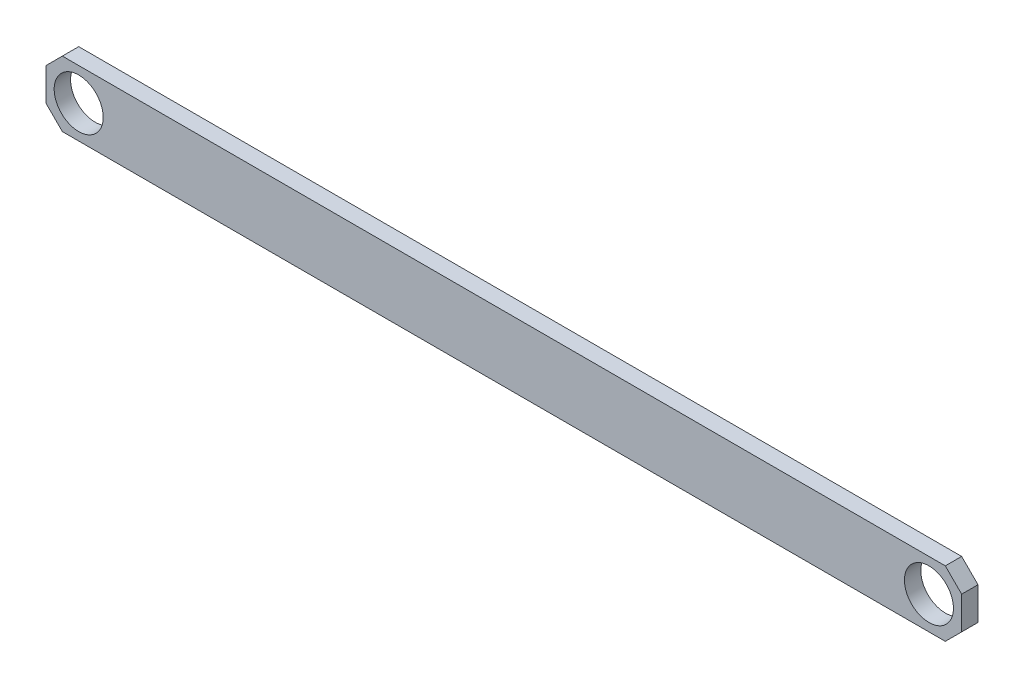
ISO-10303-21;
HEADER;
FILE_DESCRIPTION(('STEP AP214'),'2;1');
FILE_NAME('part.step','',(''),(''),'','','');
FILE_SCHEMA(('AUTOMOTIVE_DESIGN { 1 0 10303 214 1 1 1 1 }'));
ENDSEC;
DATA;
#1=APPLICATION_CONTEXT('core data for automotive mechanical design processes');
#2=APPLICATION_PROTOCOL_DEFINITION('international standard','automotive_design',2000,#1);
#3=PRODUCT_CONTEXT('',#1,'mechanical');
#4=PRODUCT('Part','Part','',(#3));
#5=PRODUCT_RELATED_PRODUCT_CATEGORY('part','',(#4));
#6=PRODUCT_DEFINITION_FORMATION('','',#4);
#7=PRODUCT_DEFINITION_CONTEXT('part definition',#1,'design');
#8=PRODUCT_DEFINITION('design','',#6,#7);
#9=PRODUCT_DEFINITION_SHAPE('','',#8);
#10=(LENGTH_UNIT() NAMED_UNIT(*) SI_UNIT(.MILLI.,.METRE.));
#11=(NAMED_UNIT(*) PLANE_ANGLE_UNIT() SI_UNIT($,.RADIAN.));
#12=(NAMED_UNIT(*) SI_UNIT($,.STERADIAN.) SOLID_ANGLE_UNIT());
#13=UNCERTAINTY_MEASURE_WITH_UNIT(LENGTH_MEASURE(1.E-05),#10,'distance_accuracy_value','');
#14=(GEOMETRIC_REPRESENTATION_CONTEXT(3) GLOBAL_UNCERTAINTY_ASSIGNED_CONTEXT((#13)) GLOBAL_UNIT_ASSIGNED_CONTEXT((#10,
#11,#12)) REPRESENTATION_CONTEXT('',''));
#15=CARTESIAN_POINT('',(0.,0.,0.));
#16=DIRECTION('',(0.,0.,1.));
#17=DIRECTION('',(1.,0.,0.));
#18=AXIS2_PLACEMENT_3D('',#15,#16,#17);
#19=CARTESIAN_POINT('',(0.,12.7,3.175));
#20=DIRECTION('',(0.,0.,-1.));
#21=DIRECTION('',(-1.,0.,0.));
#22=AXIS2_PLACEMENT_3D('',#19,#20,#21);
#23=PLANE('',#22);
#24=DIRECTION('',(-1.,0.,0.));
#25=VECTOR('',#24,1.);
#26=CARTESIAN_POINT('',(0.,12.7,3.175));
#27=LINE('',#26,#25);
#28=CARTESIAN_POINT('',(174.625,12.7,3.175));
#29=VERTEX_POINT('',#28);
#30=CARTESIAN_POINT('',(3.17500000000001,12.7,3.175));
#31=VERTEX_POINT('',#30);
#32=EDGE_CURVE('E140',#29,#31,#27,.T.);
#33=ORIENTED_EDGE('',*,*,#32,.T.);
#34=DIRECTION('',(0.707106781186549,0.707106781186546,0.));
#35=VECTOR('',#34,1.);
#36=CARTESIAN_POINT('',(0.,9.525,3.175));
#37=LINE('',#36,#35);
#38=CARTESIAN_POINT('',(0.,9.525,3.175));
#39=VERTEX_POINT('',#38);
#40=EDGE_CURVE('E159',#31,#39,#37,.F.);
#41=ORIENTED_EDGE('',*,*,#40,.T.);
#42=DIRECTION('',(0.,-1.,0.));
#43=VECTOR('',#42,1.);
#44=CARTESIAN_POINT('',(0.,0.,3.175));
#45=LINE('',#44,#43);
#46=CARTESIAN_POINT('',(0.,3.17500000000001,3.175));
#47=VERTEX_POINT('',#46);
#48=EDGE_CURVE('E123',#39,#47,#45,.T.);
#49=ORIENTED_EDGE('',*,*,#48,.T.);
#50=DIRECTION('',(-0.707106781186546,0.707106781186549,0.));
#51=VECTOR('',#50,1.);
#52=CARTESIAN_POINT('',(3.175,0.,3.175));
#53=LINE('',#52,#51);
#54=CARTESIAN_POINT('',(3.175,0.,3.175));
#55=VERTEX_POINT('',#54);
#56=EDGE_CURVE('E157',#47,#55,#53,.F.);
#57=ORIENTED_EDGE('',*,*,#56,.T.);
#58=DIRECTION('',(1.,0.,0.));
#59=VECTOR('',#58,1.);
#60=CARTESIAN_POINT('',(0.,0.,3.175));
#61=LINE('',#60,#59);
#62=CARTESIAN_POINT('',(174.625,0.,3.175));
#63=VERTEX_POINT('',#62);
#64=EDGE_CURVE('E170',#55,#63,#61,.T.);
#65=ORIENTED_EDGE('',*,*,#64,.T.);
#66=DIRECTION('',(-0.707106781186547,-0.707106781186548,0.));
#67=VECTOR('',#66,1.);
#68=CARTESIAN_POINT('',(177.8,3.17500000000001,3.175));
#69=LINE('',#68,#67);
#70=CARTESIAN_POINT('',(177.8,3.17500000000001,3.175));
#71=VERTEX_POINT('',#70);
#72=EDGE_CURVE('E58',#63,#71,#69,.F.);
#73=ORIENTED_EDGE('',*,*,#72,.T.);
#74=DIRECTION('',(0.,1.,0.));
#75=VECTOR('',#74,1.);
#76=CARTESIAN_POINT('',(177.8,0.,3.175));
#77=LINE('',#76,#75);
#78=CARTESIAN_POINT('',(177.8,9.525,3.175));
#79=VERTEX_POINT('',#78);
#80=EDGE_CURVE('E178',#71,#79,#77,.T.);
#81=ORIENTED_EDGE('',*,*,#80,.T.);
#82=DIRECTION('',(0.707106781186549,-0.707106781186546,0.));
#83=VECTOR('',#82,1.);
#84=CARTESIAN_POINT('',(174.625,12.7,3.175));
#85=LINE('',#84,#83);
#86=EDGE_CURVE('E154',#79,#29,#85,.F.);
#87=ORIENTED_EDGE('',*,*,#86,.T.);
#88=EDGE_LOOP('',(#33,#41,#49,#57,#65,#73,#81,#87));
#89=FACE_BOUND('',#88,.T.);
#90=CARTESIAN_POINT('',(6.35,6.35,3.175));
#91=DIRECTION('',(0.,0.,1.));
#92=DIRECTION('',(1.,0.,0.));
#93=AXIS2_PLACEMENT_3D('',#90,#91,#92);
#94=CIRCLE('',#93,4.7625);
#95=CARTESIAN_POINT('',(11.1125,6.35,3.175));
#96=VERTEX_POINT('',#95);
#97=EDGE_CURVE('E131',#96,#96,#94,.T.);
#98=ORIENTED_EDGE('',*,*,#97,.F.);
#99=EDGE_LOOP('',(#98));
#100=FACE_BOUND('',#99,.T.);
#101=CARTESIAN_POINT('',(171.45,6.35,3.175));
#102=DIRECTION('',(0.,0.,1.));
#103=DIRECTION('',(-1.,0.,0.));
#104=AXIS2_PLACEMENT_3D('',#101,#102,#103);
#105=CIRCLE('',#104,4.76249999999998);
#106=CARTESIAN_POINT('',(166.6875,6.35,3.175));
#107=VERTEX_POINT('',#106);
#108=EDGE_CURVE('E185',#107,#107,#105,.T.);
#109=ORIENTED_EDGE('',*,*,#108,.F.);
#110=EDGE_LOOP('',(#109));
#111=FACE_BOUND('',#110,.T.);
#112=ADVANCED_FACE('F37',(#89,#100,#111),#23,.F.);
#113=CARTESIAN_POINT('',(0.,12.7,0.));
#114=DIRECTION('',(0.,0.,-1.));
#115=DIRECTION('',(-1.,0.,0.));
#116=AXIS2_PLACEMENT_3D('',#113,#114,#115);
#117=PLANE('',#116);
#118=CARTESIAN_POINT('',(6.35,6.35,0.));
#119=DIRECTION('',(0.,0.,1.));
#120=DIRECTION('',(1.,0.,0.));
#121=AXIS2_PLACEMENT_3D('',#118,#119,#120);
#122=CIRCLE('',#121,4.7625);
#123=CARTESIAN_POINT('',(11.1125,6.35,0.));
#124=VERTEX_POINT('',#123);
#125=EDGE_CURVE('E137',#124,#124,#122,.T.);
#126=ORIENTED_EDGE('',*,*,#125,.T.);
#127=EDGE_LOOP('',(#126));
#128=FACE_BOUND('',#127,.T.);
#129=DIRECTION('',(0.,-1.,0.));
#130=VECTOR('',#129,1.);
#131=CARTESIAN_POINT('',(0.,0.,0.));
#132=LINE('',#131,#130);
#133=CARTESIAN_POINT('',(0.,9.525,0.));
#134=VERTEX_POINT('',#133);
#135=CARTESIAN_POINT('',(0.,3.17500000000001,0.));
#136=VERTEX_POINT('',#135);
#137=EDGE_CURVE('E120',#134,#136,#132,.T.);
#138=ORIENTED_EDGE('',*,*,#137,.F.);
#139=DIRECTION('',(-0.707106781186549,-0.707106781186546,0.));
#140=VECTOR('',#139,1.);
#141=CARTESIAN_POINT('',(1.5875,11.1125,0.));
#142=LINE('',#141,#140);
#143=CARTESIAN_POINT('',(3.17500000000001,12.7,0.));
#144=VERTEX_POINT('',#143);
#145=EDGE_CURVE('E103',#134,#144,#142,.F.);
#146=ORIENTED_EDGE('',*,*,#145,.T.);
#147=DIRECTION('',(-1.,0.,0.));
#148=VECTOR('',#147,1.);
#149=CARTESIAN_POINT('',(0.,12.7,0.));
#150=LINE('',#149,#148);
#151=CARTESIAN_POINT('',(174.625,12.7,0.));
#152=VERTEX_POINT('',#151);
#153=EDGE_CURVE('E144',#152,#144,#150,.T.);
#154=ORIENTED_EDGE('',*,*,#153,.F.);
#155=DIRECTION('',(-0.707106781186549,0.707106781186546,0.));
#156=VECTOR('',#155,1.);
#157=CARTESIAN_POINT('',(87.3124999999997,100.0125,0.));
#158=LINE('',#157,#156);
#159=CARTESIAN_POINT('',(177.8,9.525,0.));
#160=VERTEX_POINT('',#159);
#161=EDGE_CURVE('E124',#152,#160,#158,.F.);
#162=ORIENTED_EDGE('',*,*,#161,.T.);
#163=DIRECTION('',(0.,1.,0.));
#164=VECTOR('',#163,1.);
#165=CARTESIAN_POINT('',(177.8,0.,0.));
#166=LINE('',#165,#164);
#167=CARTESIAN_POINT('',(177.8,3.17500000000001,0.));
#168=VERTEX_POINT('',#167);
#169=EDGE_CURVE('E134',#168,#160,#166,.T.);
#170=ORIENTED_EDGE('',*,*,#169,.F.);
#171=DIRECTION('',(0.707106781186547,0.707106781186548,0.));
#172=VECTOR('',#171,1.);
#173=CARTESIAN_POINT('',(93.6625,-80.9625,0.));
#174=LINE('',#173,#172);
#175=CARTESIAN_POINT('',(174.625,0.,0.));
#176=VERTEX_POINT('',#175);
#177=EDGE_CURVE('E148',#168,#176,#174,.F.);
#178=ORIENTED_EDGE('',*,*,#177,.T.);
#179=DIRECTION('',(1.,0.,0.));
#180=VECTOR('',#179,1.);
#181=CARTESIAN_POINT('',(0.,0.,0.));
#182=LINE('',#181,#180);
#183=CARTESIAN_POINT('',(3.175,0.,0.));
#184=VERTEX_POINT('',#183);
#185=EDGE_CURVE('E130',#184,#176,#182,.T.);
#186=ORIENTED_EDGE('',*,*,#185,.F.);
#187=DIRECTION('',(0.707106781186546,-0.707106781186549,0.));
#188=VECTOR('',#187,1.);
#189=CARTESIAN_POINT('',(-4.76249999999999,7.93750000000002,0.));
#190=LINE('',#189,#188);
#191=EDGE_CURVE('E114',#184,#136,#190,.F.);
#192=ORIENTED_EDGE('',*,*,#191,.T.);
#193=EDGE_LOOP('',(#138,#146,#154,#162,#170,#178,#186,#192));
#194=FACE_BOUND('',#193,.T.);
#195=CARTESIAN_POINT('',(171.45,6.35,0.));
#196=DIRECTION('',(0.,0.,1.));
#197=DIRECTION('',(-1.,0.,0.));
#198=AXIS2_PLACEMENT_3D('',#195,#196,#197);
#199=CIRCLE('',#198,4.76249999999998);
#200=CARTESIAN_POINT('',(166.6875,6.35,0.));
#201=VERTEX_POINT('',#200);
#202=EDGE_CURVE('E187',#201,#201,#199,.T.);
#203=ORIENTED_EDGE('',*,*,#202,.T.);
#204=EDGE_LOOP('',(#203));
#205=FACE_BOUND('',#204,.T.);
#206=ADVANCED_FACE('F127',(#128,#194,#205),#117,.T.);
#207=CARTESIAN_POINT('',(0.,0.,3.175));
#208=DIRECTION('',(1.,0.,0.));
#209=DIRECTION('',(0.,0.,-1.));
#210=AXIS2_PLACEMENT_3D('',#207,#208,#209);
#211=PLANE('',#210);
#212=ORIENTED_EDGE('',*,*,#48,.F.);
#213=DIRECTION('',(0.,0.,-1.));
#214=VECTOR('',#213,1.);
#215=CARTESIAN_POINT('',(0.,9.525,3.175));
#216=LINE('',#215,#214);
#217=EDGE_CURVE('E107',#39,#134,#216,.T.);
#218=ORIENTED_EDGE('',*,*,#217,.T.);
#219=ORIENTED_EDGE('',*,*,#137,.T.);
#220=DIRECTION('',(0.,0.,1.));
#221=VECTOR('',#220,1.);
#222=CARTESIAN_POINT('',(0.,3.17500000000001,3.175));
#223=LINE('',#222,#221);
#224=EDGE_CURVE('E125',#136,#47,#223,.T.);
#225=ORIENTED_EDGE('',*,*,#224,.T.);
#226=EDGE_LOOP('',(#212,#218,#219,#225));
#227=FACE_BOUND('',#226,.T.);
#228=ADVANCED_FACE('F119',(#227),#211,.F.);
#229=CARTESIAN_POINT('',(0.,0.,3.175));
#230=DIRECTION('',(0.,1.,0.));
#231=DIRECTION('',(0.,0.,1.));
#232=AXIS2_PLACEMENT_3D('',#229,#230,#231);
#233=PLANE('',#232);
#234=ORIENTED_EDGE('',*,*,#64,.F.);
#235=DIRECTION('',(0.,0.,-1.));
#236=VECTOR('',#235,1.);
#237=CARTESIAN_POINT('',(3.175,0.,3.175));
#238=LINE('',#237,#236);
#239=EDGE_CURVE('E163',#55,#184,#238,.T.);
#240=ORIENTED_EDGE('',*,*,#239,.T.);
#241=ORIENTED_EDGE('',*,*,#185,.T.);
#242=DIRECTION('',(0.,0.,1.));
#243=VECTOR('',#242,1.);
#244=CARTESIAN_POINT('',(174.625,0.,3.175));
#245=LINE('',#244,#243);
#246=EDGE_CURVE('E161',#176,#63,#245,.T.);
#247=ORIENTED_EDGE('',*,*,#246,.T.);
#248=EDGE_LOOP('',(#234,#240,#241,#247));
#249=FACE_BOUND('',#248,.T.);
#250=ADVANCED_FACE('F168',(#249),#233,.F.);
#251=CARTESIAN_POINT('',(177.8,0.,3.175));
#252=DIRECTION('',(-1.,0.,0.));
#253=DIRECTION('',(0.,0.,1.));
#254=AXIS2_PLACEMENT_3D('',#251,#252,#253);
#255=PLANE('',#254);
#256=ORIENTED_EDGE('',*,*,#80,.F.);
#257=DIRECTION('',(0.,0.,-1.));
#258=VECTOR('',#257,1.);
#259=CARTESIAN_POINT('',(177.8,3.17500000000001,3.175));
#260=LINE('',#259,#258);
#261=EDGE_CURVE('E11',#71,#168,#260,.T.);
#262=ORIENTED_EDGE('',*,*,#261,.T.);
#263=ORIENTED_EDGE('',*,*,#169,.T.);
#264=DIRECTION('',(0.,0.,1.));
#265=VECTOR('',#264,1.);
#266=CARTESIAN_POINT('',(177.8,9.525,3.175));
#267=LINE('',#266,#265);
#268=EDGE_CURVE('E45',#160,#79,#267,.T.);
#269=ORIENTED_EDGE('',*,*,#268,.T.);
#270=EDGE_LOOP('',(#256,#262,#263,#269));
#271=FACE_BOUND('',#270,.T.);
#272=ADVANCED_FACE('F177',(#271),#255,.F.);
#273=CARTESIAN_POINT('',(0.,12.7,3.175));
#274=DIRECTION('',(0.,-1.,0.));
#275=DIRECTION('',(0.,0.,-1.));
#276=AXIS2_PLACEMENT_3D('',#273,#274,#275);
#277=PLANE('',#276);
#278=ORIENTED_EDGE('',*,*,#153,.T.);
#279=DIRECTION('',(0.,0.,1.));
#280=VECTOR('',#279,1.);
#281=CARTESIAN_POINT('',(3.17500000000001,12.7,3.175));
#282=LINE('',#281,#280);
#283=EDGE_CURVE('E108',#144,#31,#282,.T.);
#284=ORIENTED_EDGE('',*,*,#283,.T.);
#285=ORIENTED_EDGE('',*,*,#32,.F.);
#286=DIRECTION('',(0.,0.,-1.));
#287=VECTOR('',#286,1.);
#288=CARTESIAN_POINT('',(174.625,12.7,3.175));
#289=LINE('',#288,#287);
#290=EDGE_CURVE('E113',#29,#152,#289,.T.);
#291=ORIENTED_EDGE('',*,*,#290,.T.);
#292=EDGE_LOOP('',(#278,#284,#285,#291));
#293=FACE_BOUND('',#292,.T.);
#294=ADVANCED_FACE('F208',(#293),#277,.F.);
#295=CARTESIAN_POINT('',(6.35,6.35,3.175));
#296=DIRECTION('',(0.,0.,-1.));
#297=DIRECTION('',(-1.,0.,0.));
#298=AXIS2_PLACEMENT_3D('',#295,#296,#297);
#299=CYLINDRICAL_SURFACE('',#298,4.7625);
#300=ORIENTED_EDGE('',*,*,#97,.T.);
#301=EDGE_LOOP('',(#300));
#302=FACE_BOUND('',#301,.T.);
#303=ORIENTED_EDGE('',*,*,#125,.F.);
#304=EDGE_LOOP('',(#303));
#305=FACE_BOUND('',#304,.T.);
#306=ADVANCED_FACE('F205',(#302,#305),#299,.F.);
#307=CARTESIAN_POINT('',(171.45,6.35,3.175));
#308=DIRECTION('',(0.,0.,-1.));
#309=DIRECTION('',(-1.,0.,0.));
#310=AXIS2_PLACEMENT_3D('',#307,#308,#309);
#311=CYLINDRICAL_SURFACE('',#310,4.76249999999998);
#312=ORIENTED_EDGE('',*,*,#108,.T.);
#313=EDGE_LOOP('',(#312));
#314=FACE_BOUND('',#313,.T.);
#315=ORIENTED_EDGE('',*,*,#202,.F.);
#316=EDGE_LOOP('',(#315));
#317=FACE_BOUND('',#316,.T.);
#318=ADVANCED_FACE('F193',(#314,#317),#311,.F.);
#319=CARTESIAN_POINT('',(0.,9.525,3.175));
#320=DIRECTION('',(0.707106781186546,-0.707106781186549,0.));
#321=DIRECTION('',(0.707106781186549,0.707106781186546,0.));
#322=AXIS2_PLACEMENT_3D('',#319,#320,#321);
#323=PLANE('',#322);
#324=ORIENTED_EDGE('',*,*,#40,.F.);
#325=ORIENTED_EDGE('',*,*,#283,.F.);
#326=ORIENTED_EDGE('',*,*,#145,.F.);
#327=ORIENTED_EDGE('',*,*,#217,.F.);
#328=EDGE_LOOP('',(#324,#325,#326,#327));
#329=FACE_BOUND('',#328,.T.);
#330=ADVANCED_FACE('F106',(#329),#323,.F.);
#331=CARTESIAN_POINT('',(3.175,0.,3.175));
#332=DIRECTION('',(0.707106781186549,0.707106781186546,0.));
#333=DIRECTION('',(-0.707106781186546,0.707106781186549,0.));
#334=AXIS2_PLACEMENT_3D('',#331,#332,#333);
#335=PLANE('',#334);
#336=ORIENTED_EDGE('',*,*,#56,.F.);
#337=ORIENTED_EDGE('',*,*,#224,.F.);
#338=ORIENTED_EDGE('',*,*,#191,.F.);
#339=ORIENTED_EDGE('',*,*,#239,.F.);
#340=EDGE_LOOP('',(#336,#337,#338,#339));
#341=FACE_BOUND('',#340,.T.);
#342=ADVANCED_FACE('F220',(#341),#335,.F.);
#343=CARTESIAN_POINT('',(177.8,3.17500000000001,3.175));
#344=DIRECTION('',(-0.707106781186547,0.707106781186547,0.));
#345=DIRECTION('',(-0.707106781186547,-0.707106781186548,0.));
#346=AXIS2_PLACEMENT_3D('',#343,#344,#345);
#347=PLANE('',#346);
#348=ORIENTED_EDGE('',*,*,#72,.F.);
#349=ORIENTED_EDGE('',*,*,#246,.F.);
#350=ORIENTED_EDGE('',*,*,#177,.F.);
#351=ORIENTED_EDGE('',*,*,#261,.F.);
#352=EDGE_LOOP('',(#348,#349,#350,#351));
#353=FACE_BOUND('',#352,.T.);
#354=ADVANCED_FACE('F176',(#353),#347,.F.);
#355=CARTESIAN_POINT('',(174.625,12.7,3.175));
#356=DIRECTION('',(-0.707106781186546,-0.707106781186549,0.));
#357=DIRECTION('',(0.707106781186549,-0.707106781186546,0.));
#358=AXIS2_PLACEMENT_3D('',#355,#356,#357);
#359=PLANE('',#358);
#360=ORIENTED_EDGE('',*,*,#86,.F.);
#361=ORIENTED_EDGE('',*,*,#268,.F.);
#362=ORIENTED_EDGE('',*,*,#161,.F.);
#363=ORIENTED_EDGE('',*,*,#290,.F.);
#364=EDGE_LOOP('',(#360,#361,#362,#363));
#365=FACE_BOUND('',#364,.T.);
#366=ADVANCED_FACE('F39',(#365),#359,.F.);
#367=CLOSED_SHELL('',(#112,#206,#228,#250,#272,#294,#306,#318,#330,#342,#354,#366));
#368=MANIFOLD_SOLID_BREP('B2',#367);
#369=ADVANCED_BREP_SHAPE_REPRESENTATION('',(#18,#368),#14);
#370=SHAPE_DEFINITION_REPRESENTATION(#9,#369);
ENDSEC;
END-ISO-10303-21;
